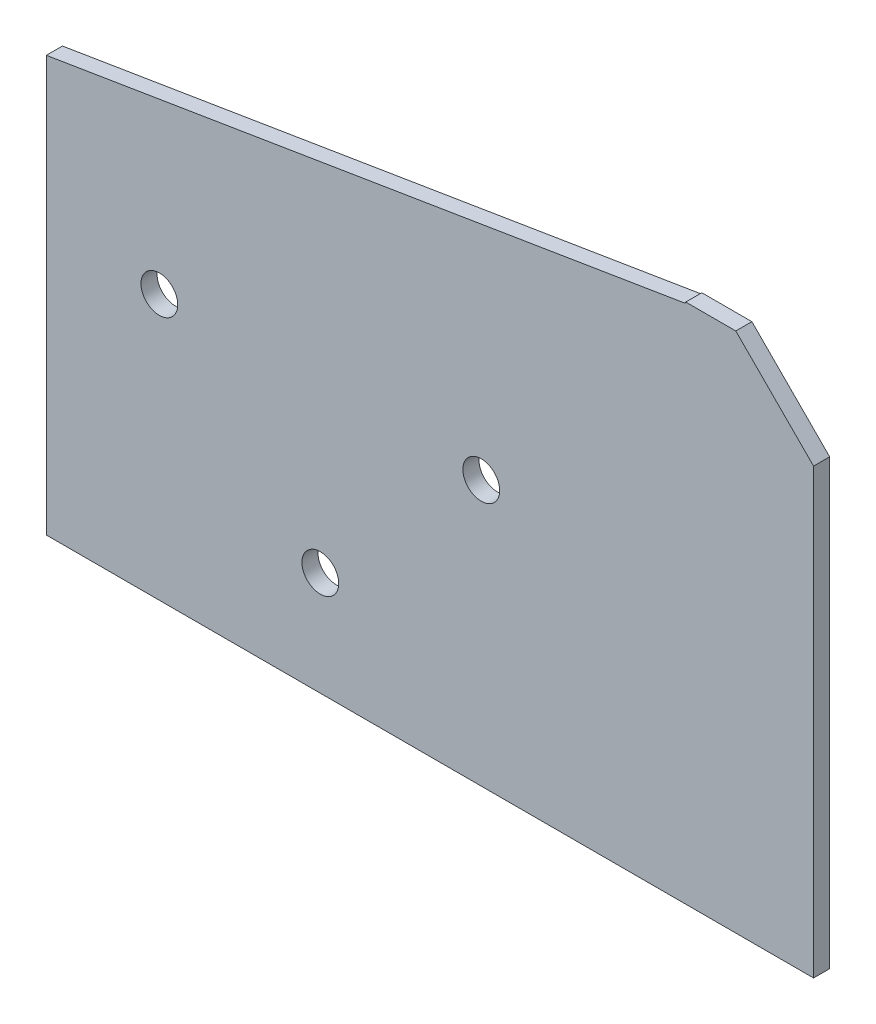
ISO-10303-21;
HEADER;
FILE_DESCRIPTION(('STEP AP214'),'2;1');
FILE_NAME('part.step','',(''),(''),'','','');
FILE_SCHEMA(('AUTOMOTIVE_DESIGN { 1 0 10303 214 1 1 1 1 }'));
ENDSEC;
DATA;
#1=APPLICATION_CONTEXT('core data for automotive mechanical design processes');
#2=APPLICATION_PROTOCOL_DEFINITION('international standard','automotive_design',2000,#1);
#3=PRODUCT_CONTEXT('',#1,'mechanical');
#4=PRODUCT('Part','Part','',(#3));
#5=PRODUCT_RELATED_PRODUCT_CATEGORY('part','',(#4));
#6=PRODUCT_DEFINITION_FORMATION('','',#4);
#7=PRODUCT_DEFINITION_CONTEXT('part definition',#1,'design');
#8=PRODUCT_DEFINITION('design','',#6,#7);
#9=PRODUCT_DEFINITION_SHAPE('','',#8);
#10=(LENGTH_UNIT() NAMED_UNIT(*) SI_UNIT(.MILLI.,.METRE.));
#11=(NAMED_UNIT(*) PLANE_ANGLE_UNIT() SI_UNIT($,.RADIAN.));
#12=(NAMED_UNIT(*) SI_UNIT($,.STERADIAN.) SOLID_ANGLE_UNIT());
#13=UNCERTAINTY_MEASURE_WITH_UNIT(LENGTH_MEASURE(1.E-05),#10,'distance_accuracy_value','');
#14=(GEOMETRIC_REPRESENTATION_CONTEXT(3) GLOBAL_UNCERTAINTY_ASSIGNED_CONTEXT((#13)) GLOBAL_UNIT_ASSIGNED_CONTEXT((#10,
#11,#12)) REPRESENTATION_CONTEXT('',''));
#15=CARTESIAN_POINT('',(0.,0.,0.));
#16=DIRECTION('',(0.,0.,1.));
#17=DIRECTION('',(1.,0.,0.));
#18=AXIS2_PLACEMENT_3D('',#15,#16,#17);
#19=CARTESIAN_POINT('',(0.,0.,54.3));
#20=DIRECTION('',(0.,0.,1.));
#21=DIRECTION('',(1.,0.,0.));
#22=AXIS2_PLACEMENT_3D('',#19,#20,#21);
#23=PLANE('',#22);
#24=CARTESIAN_POINT('',(7.,-20.02,54.3));
#25=DIRECTION('',(0.,0.,1.));
#26=DIRECTION('',(1.,0.,0.));
#27=AXIS2_PLACEMENT_3D('',#24,#25,#26);
#28=CIRCLE('',#27,0.8);
#29=CARTESIAN_POINT('',(7.8,-20.02,54.3));
#30=VERTEX_POINT('',#29);
#31=EDGE_CURVE('E138',#30,#30,#28,.T.);
#32=ORIENTED_EDGE('',*,*,#31,.F.);
#33=EDGE_LOOP('',(#32));
#34=FACE_BOUND('',#33,.T.);
#35=CARTESIAN_POINT('',(-7.,-20.02,54.3));
#36=DIRECTION('',(0.,0.,1.));
#37=DIRECTION('',(1.,0.,0.));
#38=AXIS2_PLACEMENT_3D('',#35,#36,#37);
#39=CIRCLE('',#38,0.8);
#40=CARTESIAN_POINT('',(-6.2,-20.02,54.3));
#41=VERTEX_POINT('',#40);
#42=EDGE_CURVE('E150',#41,#41,#39,.T.);
#43=ORIENTED_EDGE('',*,*,#42,.F.);
#44=EDGE_LOOP('',(#43));
#45=FACE_BOUND('',#44,.T.);
#46=CARTESIAN_POINT('',(0.,-27.02,54.3));
#47=DIRECTION('',(0.,0.,1.));
#48=DIRECTION('',(1.,0.,0.));
#49=AXIS2_PLACEMENT_3D('',#46,#47,#48);
#50=CIRCLE('',#49,0.799999999999999);
#51=CARTESIAN_POINT('',(0.800000000000002,-27.02,54.3));
#52=VERTEX_POINT('',#51);
#53=EDGE_CURVE('E144',#52,#52,#50,.T.);
#54=ORIENTED_EDGE('',*,*,#53,.F.);
#55=EDGE_LOOP('',(#54));
#56=FACE_BOUND('',#55,.T.);
#57=DIRECTION('',(-1.,0.,0.));
#58=VECTOR('',#57,1.);
#59=CARTESIAN_POINT('',(18.066885043344,-8.87271053069155,54.3));
#60=LINE('',#59,#58);
#61=CARTESIAN_POINT('',(18.066885043344,-8.87271053069155,54.3));
#62=VERTEX_POINT('',#61);
#63=CARTESIAN_POINT('',(15.8907208092822,-8.87271053069155,54.3));
#64=VERTEX_POINT('',#63);
#65=EDGE_CURVE('E126',#62,#64,#60,.T.);
#66=ORIENTED_EDGE('',*,*,#65,.T.);
#67=CARTESIAN_POINT('',(0.,0.,54.3));
#68=DIRECTION('',(0.,0.,-1.));
#69=DIRECTION('',(1.,0.,0.));
#70=AXIS2_PLACEMENT_3D('',#67,#68,#69);
#71=CIRCLE('',#70,18.2);
#72=CARTESIAN_POINT('',(15.8575929272856,-8.93178294365133,54.3));
#73=VERTEX_POINT('',#72);
#74=EDGE_CURVE('E118',#64,#73,#71,.T.);
#75=ORIENTED_EDGE('',*,*,#74,.T.);
#76=DIRECTION('',(-0.9868379586918,-0.161712223672182,0.));
#77=VECTOR('',#76,1.);
#78=CARTESIAN_POINT('',(15.8575929272856,-8.93178294365133,54.3));
#79=LINE('',#78,#77);
#80=CARTESIAN_POINT('',(-11.9147172272882,-13.482805725105,54.3));
#81=VERTEX_POINT('',#80);
#82=EDGE_CURVE('E116',#73,#81,#79,.T.);
#83=ORIENTED_EDGE('',*,*,#82,.T.);
#84=DIRECTION('',(0.,-1.,0.));
#85=VECTOR('',#84,1.);
#86=CARTESIAN_POINT('',(-11.9147172272882,-13.482805725105,54.3));
#87=LINE('',#86,#85);
#88=CARTESIAN_POINT('',(-11.9147172272882,-31.55,54.3));
#89=VERTEX_POINT('',#88);
#90=EDGE_CURVE('E52',#81,#89,#87,.T.);
#91=ORIENTED_EDGE('',*,*,#90,.T.);
#92=DIRECTION('',(1.,0.,0.));
#93=VECTOR('',#92,1.);
#94=CARTESIAN_POINT('',(-11.9147172272882,-31.55,54.3));
#95=LINE('',#94,#93);
#96=CARTESIAN_POINT('',(21.45,-31.55,54.3));
#97=VERTEX_POINT('',#96);
#98=EDGE_CURVE('E105',#89,#97,#95,.T.);
#99=ORIENTED_EDGE('',*,*,#98,.T.);
#100=DIRECTION('',(0.,1.,0.));
#101=VECTOR('',#100,1.);
#102=CARTESIAN_POINT('',(21.45,-31.55,54.3));
#103=LINE('',#102,#101);
#104=CARTESIAN_POINT('',(21.45,-12.2715775545315,54.3));
#105=VERTEX_POINT('',#104);
#106=EDGE_CURVE('E111',#97,#105,#103,.T.);
#107=ORIENTED_EDGE('',*,*,#106,.T.);
#108=DIRECTION('',(-0.705462527534793,0.708747220272659,0.));
#109=VECTOR('',#108,1.);
#110=CARTESIAN_POINT('',(21.45,-12.2715775545315,54.3));
#111=LINE('',#110,#109);
#112=EDGE_CURVE('E123',#105,#62,#111,.T.);
#113=ORIENTED_EDGE('',*,*,#112,.T.);
#114=EDGE_LOOP('',(#66,#75,#83,#91,#99,#107,#113));
#115=FACE_BOUND('',#114,.T.);
#116=ADVANCED_FACE('F37',(#34,#45,#56,#115),#23,.T.);
#117=CARTESIAN_POINT('',(0.,0.,53.6));
#118=DIRECTION('',(0.,0.,1.));
#119=DIRECTION('',(1.,0.,0.));
#120=AXIS2_PLACEMENT_3D('',#117,#118,#119);
#121=PLANE('',#120);
#122=CARTESIAN_POINT('',(7.,-20.02,53.6));
#123=DIRECTION('',(0.,0.,1.));
#124=DIRECTION('',(1.,0.,0.));
#125=AXIS2_PLACEMENT_3D('',#122,#123,#124);
#126=CIRCLE('',#125,0.8);
#127=CARTESIAN_POINT('',(7.8,-20.02,53.6));
#128=VERTEX_POINT('',#127);
#129=EDGE_CURVE('E130',#128,#128,#126,.T.);
#130=ORIENTED_EDGE('',*,*,#129,.T.);
#131=EDGE_LOOP('',(#130));
#132=FACE_BOUND('',#131,.T.);
#133=CARTESIAN_POINT('',(0.,-27.02,53.6));
#134=DIRECTION('',(0.,0.,1.));
#135=DIRECTION('',(1.,0.,0.));
#136=AXIS2_PLACEMENT_3D('',#133,#134,#135);
#137=CIRCLE('',#136,0.799999999999999);
#138=CARTESIAN_POINT('',(0.800000000000002,-27.02,53.6));
#139=VERTEX_POINT('',#138);
#140=EDGE_CURVE('E141',#139,#139,#137,.T.);
#141=ORIENTED_EDGE('',*,*,#140,.T.);
#142=EDGE_LOOP('',(#141));
#143=FACE_BOUND('',#142,.T.);
#144=CARTESIAN_POINT('',(-7.,-20.02,53.6));
#145=DIRECTION('',(0.,0.,1.));
#146=DIRECTION('',(1.,0.,0.));
#147=AXIS2_PLACEMENT_3D('',#144,#145,#146);
#148=CIRCLE('',#147,0.8);
#149=CARTESIAN_POINT('',(-6.2,-20.02,53.6));
#150=VERTEX_POINT('',#149);
#151=EDGE_CURVE('E147',#150,#150,#148,.T.);
#152=ORIENTED_EDGE('',*,*,#151,.T.);
#153=EDGE_LOOP('',(#152));
#154=FACE_BOUND('',#153,.T.);
#155=CARTESIAN_POINT('',(0.,0.,53.6));
#156=DIRECTION('',(0.,0.,1.));
#157=DIRECTION('',(1.,0.,0.));
#158=AXIS2_PLACEMENT_3D('',#155,#156,#157);
#159=CIRCLE('',#158,18.2);
#160=CARTESIAN_POINT('',(15.8907208092822,-8.87271053069155,53.6));
#161=VERTEX_POINT('',#160);
#162=CARTESIAN_POINT('',(15.8575929272856,-8.93178294365133,53.6));
#163=VERTEX_POINT('',#162);
#164=EDGE_CURVE('E11',#161,#163,#159,.F.);
#165=ORIENTED_EDGE('',*,*,#164,.F.);
#166=DIRECTION('',(-1.,0.,0.));
#167=VECTOR('',#166,1.);
#168=CARTESIAN_POINT('',(0.,-8.87271053069155,53.6));
#169=LINE('',#168,#167);
#170=CARTESIAN_POINT('',(18.066885043344,-8.87271053069155,53.6));
#171=VERTEX_POINT('',#170);
#172=EDGE_CURVE('E45',#171,#161,#169,.T.);
#173=ORIENTED_EDGE('',*,*,#172,.F.);
#174=DIRECTION('',(-0.705462527534793,0.708747220272659,0.));
#175=VECTOR('',#174,1.);
#176=CARTESIAN_POINT('',(4.63909767016422,4.61759774749563,53.6));
#177=LINE('',#176,#175);
#178=CARTESIAN_POINT('',(21.45,-12.2715775545315,53.6));
#179=VERTEX_POINT('',#178);
#180=EDGE_CURVE('E162',#179,#171,#177,.T.);
#181=ORIENTED_EDGE('',*,*,#180,.F.);
#182=DIRECTION('',(0.,1.,0.));
#183=VECTOR('',#182,1.);
#184=CARTESIAN_POINT('',(21.45,0.,53.6));
#185=LINE('',#184,#183);
#186=CARTESIAN_POINT('',(21.45,-31.55,53.6));
#187=VERTEX_POINT('',#186);
#188=EDGE_CURVE('E160',#187,#179,#185,.T.);
#189=ORIENTED_EDGE('',*,*,#188,.F.);
#190=DIRECTION('',(1.,0.,0.));
#191=VECTOR('',#190,1.);
#192=CARTESIAN_POINT('',(0.,-31.55,53.6));
#193=LINE('',#192,#191);
#194=CARTESIAN_POINT('',(-11.9147172272882,-31.55,53.6));
#195=VERTEX_POINT('',#194);
#196=EDGE_CURVE('E158',#195,#187,#193,.T.);
#197=ORIENTED_EDGE('',*,*,#196,.F.);
#198=DIRECTION('',(0.,-1.,0.));
#199=VECTOR('',#198,1.);
#200=CARTESIAN_POINT('',(-11.9147172272882,0.,53.6));
#201=LINE('',#200,#199);
#202=CARTESIAN_POINT('',(-11.9147172272882,-13.482805725105,53.6));
#203=VERTEX_POINT('',#202);
#204=EDGE_CURVE('E98',#203,#195,#201,.T.);
#205=ORIENTED_EDGE('',*,*,#204,.F.);
#206=DIRECTION('',(-0.9868379586918,-0.161712223672182,0.));
#207=VECTOR('',#206,1.);
#208=CARTESIAN_POINT('',(1.84005693946002,-11.2288236026883,53.6));
#209=LINE('',#208,#207);
#210=EDGE_CURVE('E153',#163,#203,#209,.T.);
#211=ORIENTED_EDGE('',*,*,#210,.F.);
#212=EDGE_LOOP('',(#165,#173,#181,#189,#197,#205,#211));
#213=FACE_BOUND('',#212,.T.);
#214=ADVANCED_FACE('F39',(#132,#143,#154,#213),#121,.F.);
#215=CARTESIAN_POINT('',(-7.,-20.02,54.3));
#216=DIRECTION('',(0.,0.,-1.));
#217=DIRECTION('',(-1.,0.,0.));
#218=AXIS2_PLACEMENT_3D('',#215,#216,#217);
#219=CYLINDRICAL_SURFACE('',#218,0.8);
#220=ORIENTED_EDGE('',*,*,#42,.T.);
#221=EDGE_LOOP('',(#220));
#222=FACE_BOUND('',#221,.T.);
#223=ORIENTED_EDGE('',*,*,#151,.F.);
#224=EDGE_LOOP('',(#223));
#225=FACE_BOUND('',#224,.T.);
#226=ADVANCED_FACE('F198',(#222,#225),#219,.F.);
#227=CARTESIAN_POINT('',(0.,-27.02,54.3));
#228=DIRECTION('',(0.,0.,-1.));
#229=DIRECTION('',(-1.,0.,0.));
#230=AXIS2_PLACEMENT_3D('',#227,#228,#229);
#231=CYLINDRICAL_SURFACE('',#230,0.799999999999999);
#232=ORIENTED_EDGE('',*,*,#53,.T.);
#233=EDGE_LOOP('',(#232));
#234=FACE_BOUND('',#233,.T.);
#235=ORIENTED_EDGE('',*,*,#140,.F.);
#236=EDGE_LOOP('',(#235));
#237=FACE_BOUND('',#236,.T.);
#238=ADVANCED_FACE('F205',(#234,#237),#231,.F.);
#239=CARTESIAN_POINT('',(7.,-20.02,54.3));
#240=DIRECTION('',(0.,0.,-1.));
#241=DIRECTION('',(-1.,0.,0.));
#242=AXIS2_PLACEMENT_3D('',#239,#240,#241);
#243=CYLINDRICAL_SURFACE('',#242,0.8);
#244=ORIENTED_EDGE('',*,*,#31,.T.);
#245=EDGE_LOOP('',(#244));
#246=FACE_BOUND('',#245,.T.);
#247=ORIENTED_EDGE('',*,*,#129,.F.);
#248=EDGE_LOOP('',(#247));
#249=FACE_BOUND('',#248,.T.);
#250=ADVANCED_FACE('F209',(#246,#249),#243,.F.);
#251=CARTESIAN_POINT('',(0.,0.,44.3));
#252=DIRECTION('',(0.,0.,1.));
#253=DIRECTION('',(1.,0.,0.));
#254=AXIS2_PLACEMENT_3D('',#251,#252,#253);
#255=CYLINDRICAL_SURFACE('',#254,18.2);
#256=ORIENTED_EDGE('',*,*,#164,.T.);
#257=DIRECTION('',(0.,0.,1.));
#258=VECTOR('',#257,1.);
#259=CARTESIAN_POINT('',(15.8575929272856,-8.93178294365133,44.3));
#260=LINE('',#259,#258);
#261=EDGE_CURVE('E60',#163,#73,#260,.T.);
#262=ORIENTED_EDGE('',*,*,#261,.T.);
#263=ORIENTED_EDGE('',*,*,#74,.F.);
#264=DIRECTION('',(0.,0.,1.));
#265=VECTOR('',#264,1.);
#266=CARTESIAN_POINT('',(15.8907208092822,-8.87271053069155,44.3));
#267=LINE('',#266,#265);
#268=EDGE_CURVE('E128',#161,#64,#267,.T.);
#269=ORIENTED_EDGE('',*,*,#268,.F.);
#270=EDGE_LOOP('',(#256,#262,#263,#269));
#271=FACE_BOUND('',#270,.T.);
#272=ADVANCED_FACE('F174',(#271),#255,.F.);
#273=CARTESIAN_POINT('',(18.066885043344,-8.87271053069155,44.3));
#274=DIRECTION('',(0.,1.,0.));
#275=DIRECTION('',(0.,0.,1.));
#276=AXIS2_PLACEMENT_3D('',#273,#274,#275);
#277=PLANE('',#276);
#278=ORIENTED_EDGE('',*,*,#172,.T.);
#279=ORIENTED_EDGE('',*,*,#268,.T.);
#280=ORIENTED_EDGE('',*,*,#65,.F.);
#281=DIRECTION('',(0.,0.,1.));
#282=VECTOR('',#281,1.);
#283=CARTESIAN_POINT('',(18.066885043344,-8.87271053069155,44.3));
#284=LINE('',#283,#282);
#285=EDGE_CURVE('E131',#171,#62,#284,.T.);
#286=ORIENTED_EDGE('',*,*,#285,.F.);
#287=EDGE_LOOP('',(#278,#279,#280,#286));
#288=FACE_BOUND('',#287,.T.);
#289=ADVANCED_FACE('F167',(#288),#277,.T.);
#290=CARTESIAN_POINT('',(21.45,-12.2715775545315,44.3));
#291=DIRECTION('',(0.708747220272659,0.705462527534793,0.));
#292=DIRECTION('',(-0.705462527534793,0.708747220272659,0.));
#293=AXIS2_PLACEMENT_3D('',#290,#291,#292);
#294=PLANE('',#293);
#295=ORIENTED_EDGE('',*,*,#180,.T.);
#296=ORIENTED_EDGE('',*,*,#285,.T.);
#297=ORIENTED_EDGE('',*,*,#112,.F.);
#298=DIRECTION('',(0.,0.,1.));
#299=VECTOR('',#298,1.);
#300=CARTESIAN_POINT('',(21.45,-12.2715775545315,44.3));
#301=LINE('',#300,#299);
#302=EDGE_CURVE('E133',#179,#105,#301,.T.);
#303=ORIENTED_EDGE('',*,*,#302,.F.);
#304=EDGE_LOOP('',(#295,#296,#297,#303));
#305=FACE_BOUND('',#304,.T.);
#306=ADVANCED_FACE('F180',(#305),#294,.T.);
#307=CARTESIAN_POINT('',(21.45,-31.55,44.3));
#308=DIRECTION('',(1.,0.,0.));
#309=DIRECTION('',(0.,0.,-1.));
#310=AXIS2_PLACEMENT_3D('',#307,#308,#309);
#311=PLANE('',#310);
#312=ORIENTED_EDGE('',*,*,#188,.T.);
#313=ORIENTED_EDGE('',*,*,#302,.T.);
#314=ORIENTED_EDGE('',*,*,#106,.F.);
#315=DIRECTION('',(0.,0.,1.));
#316=VECTOR('',#315,1.);
#317=CARTESIAN_POINT('',(21.45,-31.55,44.3));
#318=LINE('',#317,#316);
#319=EDGE_CURVE('E101',#187,#97,#318,.T.);
#320=ORIENTED_EDGE('',*,*,#319,.F.);
#321=EDGE_LOOP('',(#312,#313,#314,#320));
#322=FACE_BOUND('',#321,.T.);
#323=ADVANCED_FACE('F183',(#322),#311,.T.);
#324=CARTESIAN_POINT('',(-11.9147172272882,-31.55,44.3));
#325=DIRECTION('',(0.,-1.,0.));
#326=DIRECTION('',(0.,0.,-1.));
#327=AXIS2_PLACEMENT_3D('',#324,#325,#326);
#328=PLANE('',#327);
#329=ORIENTED_EDGE('',*,*,#196,.T.);
#330=ORIENTED_EDGE('',*,*,#319,.T.);
#331=ORIENTED_EDGE('',*,*,#98,.F.);
#332=DIRECTION('',(0.,0.,1.));
#333=VECTOR('',#332,1.);
#334=CARTESIAN_POINT('',(-11.9147172272882,-31.55,44.3));
#335=LINE('',#334,#333);
#336=EDGE_CURVE('E94',#195,#89,#335,.T.);
#337=ORIENTED_EDGE('',*,*,#336,.F.);
#338=EDGE_LOOP('',(#329,#330,#331,#337));
#339=FACE_BOUND('',#338,.T.);
#340=ADVANCED_FACE('F106',(#339),#328,.T.);
#341=CARTESIAN_POINT('',(-11.9147172272882,-13.482805725105,44.3));
#342=DIRECTION('',(-1.,0.,0.));
#343=DIRECTION('',(0.,0.,1.));
#344=AXIS2_PLACEMENT_3D('',#341,#342,#343);
#345=PLANE('',#344);
#346=ORIENTED_EDGE('',*,*,#204,.T.);
#347=ORIENTED_EDGE('',*,*,#336,.T.);
#348=ORIENTED_EDGE('',*,*,#90,.F.);
#349=DIRECTION('',(0.,0.,1.));
#350=VECTOR('',#349,1.);
#351=CARTESIAN_POINT('',(-11.9147172272882,-13.482805725105,44.3));
#352=LINE('',#351,#350);
#353=EDGE_CURVE('E102',#203,#81,#352,.T.);
#354=ORIENTED_EDGE('',*,*,#353,.F.);
#355=EDGE_LOOP('',(#346,#347,#348,#354));
#356=FACE_BOUND('',#355,.T.);
#357=ADVANCED_FACE('F96',(#356),#345,.T.);
#358=CARTESIAN_POINT('',(15.8575929272856,-8.93178294365133,44.3));
#359=DIRECTION('',(-0.161712223672182,0.9868379586918,0.));
#360=DIRECTION('',(-0.9868379586918,-0.161712223672182,0.));
#361=AXIS2_PLACEMENT_3D('',#358,#359,#360);
#362=PLANE('',#361);
#363=ORIENTED_EDGE('',*,*,#210,.T.);
#364=ORIENTED_EDGE('',*,*,#353,.T.);
#365=ORIENTED_EDGE('',*,*,#82,.F.);
#366=ORIENTED_EDGE('',*,*,#261,.F.);
#367=EDGE_LOOP('',(#363,#364,#365,#366));
#368=FACE_BOUND('',#367,.T.);
#369=ADVANCED_FACE('F176',(#368),#362,.T.);
#370=CLOSED_SHELL('',(#116,#214,#226,#238,#250,#272,#289,#306,#323,#340,#357,#369));
#371=MANIFOLD_SOLID_BREP('B2',#370);
#372=ADVANCED_BREP_SHAPE_REPRESENTATION('',(#18,#371),#14);
#373=SHAPE_DEFINITION_REPRESENTATION(#9,#372);
ENDSEC;
END-ISO-10303-21;
